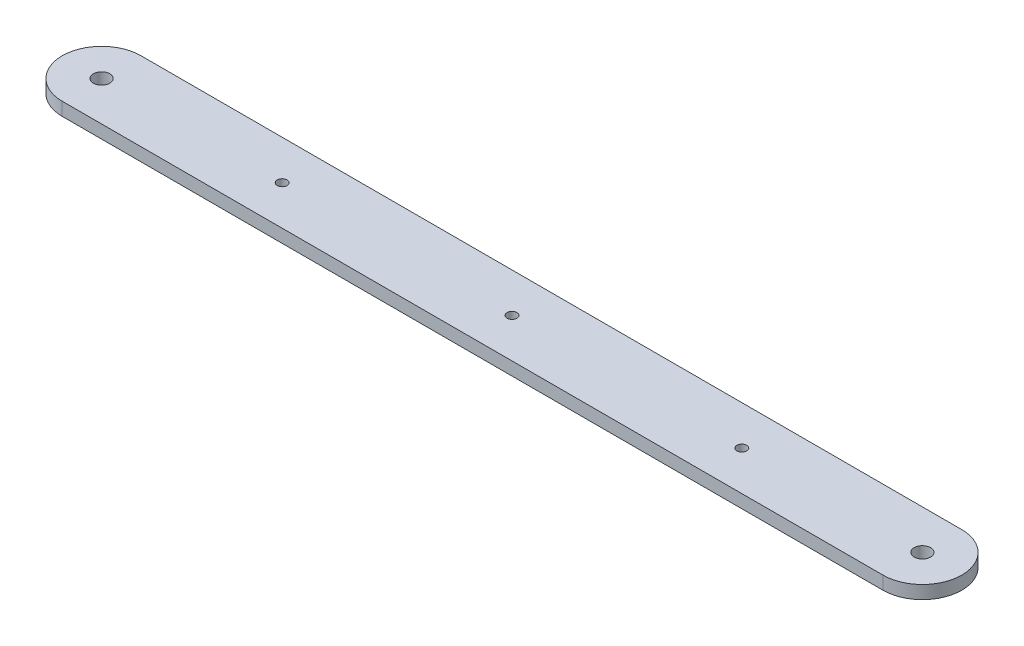
ISO-10303-21;
HEADER;
FILE_DESCRIPTION(('STEP AP214'),'2;1');
FILE_NAME('part.step','',(''),(''),'','','');
FILE_SCHEMA(('AUTOMOTIVE_DESIGN { 1 0 10303 214 1 1 1 1 }'));
ENDSEC;
DATA;
#1=APPLICATION_CONTEXT('core data for automotive mechanical design processes');
#2=APPLICATION_PROTOCOL_DEFINITION('international standard','automotive_design',2000,#1);
#3=PRODUCT_CONTEXT('',#1,'mechanical');
#4=PRODUCT('Part','Part','',(#3));
#5=PRODUCT_RELATED_PRODUCT_CATEGORY('part','',(#4));
#6=PRODUCT_DEFINITION_FORMATION('','',#4);
#7=PRODUCT_DEFINITION_CONTEXT('part definition',#1,'design');
#8=PRODUCT_DEFINITION('design','',#6,#7);
#9=PRODUCT_DEFINITION_SHAPE('','',#8);
#10=(LENGTH_UNIT() NAMED_UNIT(*) SI_UNIT(.MILLI.,.METRE.));
#11=(NAMED_UNIT(*) PLANE_ANGLE_UNIT() SI_UNIT($,.RADIAN.));
#12=(NAMED_UNIT(*) SI_UNIT($,.STERADIAN.) SOLID_ANGLE_UNIT());
#13=UNCERTAINTY_MEASURE_WITH_UNIT(LENGTH_MEASURE(1.E-05),#10,'distance_accuracy_value','');
#14=(GEOMETRIC_REPRESENTATION_CONTEXT(3) GLOBAL_UNCERTAINTY_ASSIGNED_CONTEXT((#13)) GLOBAL_UNIT_ASSIGNED_CONTEXT((#10,
#11,#12)) REPRESENTATION_CONTEXT('',''));
#15=CARTESIAN_POINT('',(0.,0.,0.));
#16=DIRECTION('',(0.,0.,1.));
#17=DIRECTION('',(1.,0.,0.));
#18=AXIS2_PLACEMENT_3D('',#15,#16,#17);
#19=CARTESIAN_POINT('',(-125.,4.,0.));
#20=DIRECTION('',(0.,1.,0.));
#21=DIRECTION('',(0.,0.,1.));
#22=AXIS2_PLACEMENT_3D('',#19,#20,#21);
#23=PLANE('',#22);
#24=CARTESIAN_POINT('',(-70.,4.,0.));
#25=DIRECTION('',(0.,-1.,0.));
#26=DIRECTION('',(0.,0.,-1.));
#27=AXIS2_PLACEMENT_3D('',#24,#25,#26);
#28=CIRCLE('',#27,1.5);
#29=CARTESIAN_POINT('',(-70.,4.,-1.5));
#30=VERTEX_POINT('',#29);
#31=EDGE_CURVE('E150',#30,#30,#28,.T.);
#32=ORIENTED_EDGE('',*,*,#31,.T.);
#33=EDGE_LOOP('',(#32));
#34=FACE_BOUND('',#33,.T.);
#35=CARTESIAN_POINT('',(0.,4.,0.));
#36=DIRECTION('',(0.,-1.,0.));
#37=DIRECTION('',(0.,0.,-1.));
#38=AXIS2_PLACEMENT_3D('',#35,#36,#37);
#39=CIRCLE('',#38,1.5);
#40=CARTESIAN_POINT('',(0.,4.,-1.49999999999999));
#41=VERTEX_POINT('',#40);
#42=EDGE_CURVE('E160',#41,#41,#39,.T.);
#43=ORIENTED_EDGE('',*,*,#42,.T.);
#44=EDGE_LOOP('',(#43));
#45=FACE_BOUND('',#44,.T.);
#46=CARTESIAN_POINT('',(70.,4.,0.));
#47=DIRECTION('',(0.,-1.,0.));
#48=DIRECTION('',(0.,0.,-1.));
#49=AXIS2_PLACEMENT_3D('',#46,#47,#48);
#50=CIRCLE('',#49,1.5);
#51=CARTESIAN_POINT('',(70.,4.,-1.49999999999997));
#52=VERTEX_POINT('',#51);
#53=EDGE_CURVE('E153',#52,#52,#50,.T.);
#54=ORIENTED_EDGE('',*,*,#53,.T.);
#55=EDGE_LOOP('',(#54));
#56=FACE_BOUND('',#55,.T.);
#57=CARTESIAN_POINT('',(125.,4.,0.));
#58=DIRECTION('',(0.,1.,0.));
#59=DIRECTION('',(0.,0.,1.));
#60=AXIS2_PLACEMENT_3D('',#57,#58,#59);
#61=CIRCLE('',#60,2.5);
#62=CARTESIAN_POINT('',(125.,4.,2.5));
#63=VERTEX_POINT('',#62);
#64=EDGE_CURVE('E115',#63,#63,#61,.T.);
#65=ORIENTED_EDGE('',*,*,#64,.F.);
#66=EDGE_LOOP('',(#65));
#67=FACE_BOUND('',#66,.T.);
#68=CARTESIAN_POINT('',(-125.,4.,0.));
#69=DIRECTION('',(0.,1.,0.));
#70=DIRECTION('',(0.,0.,1.));
#71=AXIS2_PLACEMENT_3D('',#68,#69,#70);
#72=CIRCLE('',#71,12.);
#73=CARTESIAN_POINT('',(-125.,4.,-12.));
#74=VERTEX_POINT('',#73);
#75=CARTESIAN_POINT('',(-125.,4.,12.));
#76=VERTEX_POINT('',#75);
#77=EDGE_CURVE('E98',#74,#76,#72,.T.);
#78=ORIENTED_EDGE('',*,*,#77,.T.);
#79=DIRECTION('',(1.,0.,0.));
#80=VECTOR('',#79,1.);
#81=CARTESIAN_POINT('',(-125.,4.,12.));
#82=LINE('',#81,#80);
#83=CARTESIAN_POINT('',(125.,4.,12.));
#84=VERTEX_POINT('',#83);
#85=EDGE_CURVE('E93',#76,#84,#82,.T.);
#86=ORIENTED_EDGE('',*,*,#85,.T.);
#87=CARTESIAN_POINT('',(125.,4.,0.));
#88=DIRECTION('',(0.,1.,0.));
#89=DIRECTION('',(0.,0.,1.));
#90=AXIS2_PLACEMENT_3D('',#87,#88,#89);
#91=CIRCLE('',#90,12.);
#92=CARTESIAN_POINT('',(125.,4.,-12.));
#93=VERTEX_POINT('',#92);
#94=EDGE_CURVE('E96',#84,#93,#91,.T.);
#95=ORIENTED_EDGE('',*,*,#94,.T.);
#96=DIRECTION('',(-1.,0.,0.));
#97=VECTOR('',#96,1.);
#98=CARTESIAN_POINT('',(-125.,4.,-12.));
#99=LINE('',#98,#97);
#100=EDGE_CURVE('E63',#93,#74,#99,.T.);
#101=ORIENTED_EDGE('',*,*,#100,.T.);
#102=EDGE_LOOP('',(#78,#86,#95,#101));
#103=FACE_BOUND('',#102,.T.);
#104=CARTESIAN_POINT('',(-125.,4.,0.));
#105=DIRECTION('',(0.,1.,0.));
#106=DIRECTION('',(0.,0.,1.));
#107=AXIS2_PLACEMENT_3D('',#104,#105,#106);
#108=CIRCLE('',#107,2.5);
#109=CARTESIAN_POINT('',(-125.,4.,2.5));
#110=VERTEX_POINT('',#109);
#111=EDGE_CURVE('E143',#110,#110,#108,.T.);
#112=ORIENTED_EDGE('',*,*,#111,.F.);
#113=EDGE_LOOP('',(#112));
#114=FACE_BOUND('',#113,.T.);
#115=ADVANCED_FACE('F46',(#34,#45,#56,#67,#103,#114),#23,.T.);
#116=CARTESIAN_POINT('',(-125.,0.,0.));
#117=DIRECTION('',(0.,1.,0.));
#118=DIRECTION('',(0.,0.,1.));
#119=AXIS2_PLACEMENT_3D('',#116,#117,#118);
#120=PLANE('',#119);
#121=CARTESIAN_POINT('',(-70.,0.,0.));
#122=DIRECTION('',(0.,-1.,0.));
#123=DIRECTION('',(0.,0.,-1.));
#124=AXIS2_PLACEMENT_3D('',#121,#122,#123);
#125=CIRCLE('',#124,1.5);
#126=CARTESIAN_POINT('',(-70.,0.,-1.5));
#127=VERTEX_POINT('',#126);
#128=EDGE_CURVE('E168',#127,#127,#125,.T.);
#129=ORIENTED_EDGE('',*,*,#128,.F.);
#130=EDGE_LOOP('',(#129));
#131=FACE_BOUND('',#130,.T.);
#132=CARTESIAN_POINT('',(0.,0.,0.));
#133=DIRECTION('',(0.,-1.,0.));
#134=DIRECTION('',(0.,0.,-1.));
#135=AXIS2_PLACEMENT_3D('',#132,#133,#134);
#136=CIRCLE('',#135,1.5);
#137=CARTESIAN_POINT('',(0.,0.,-1.49999999999999));
#138=VERTEX_POINT('',#137);
#139=EDGE_CURVE('E163',#138,#138,#136,.T.);
#140=ORIENTED_EDGE('',*,*,#139,.F.);
#141=EDGE_LOOP('',(#140));
#142=FACE_BOUND('',#141,.T.);
#143=CARTESIAN_POINT('',(70.,0.,0.));
#144=DIRECTION('',(0.,-1.,0.));
#145=DIRECTION('',(0.,0.,-1.));
#146=AXIS2_PLACEMENT_3D('',#143,#144,#145);
#147=CIRCLE('',#146,1.5);
#148=CARTESIAN_POINT('',(70.,0.,-1.49999999999997));
#149=VERTEX_POINT('',#148);
#150=EDGE_CURVE('E155',#149,#149,#147,.T.);
#151=ORIENTED_EDGE('',*,*,#150,.F.);
#152=EDGE_LOOP('',(#151));
#153=FACE_BOUND('',#152,.T.);
#154=CARTESIAN_POINT('',(-125.,0.,0.));
#155=DIRECTION('',(0.,1.,0.));
#156=DIRECTION('',(0.,0.,1.));
#157=AXIS2_PLACEMENT_3D('',#154,#155,#156);
#158=CIRCLE('',#157,12.);
#159=CARTESIAN_POINT('',(-125.,0.,-12.));
#160=VERTEX_POINT('',#159);
#161=CARTESIAN_POINT('',(-125.,0.,12.));
#162=VERTEX_POINT('',#161);
#163=EDGE_CURVE('E110',#160,#162,#158,.T.);
#164=ORIENTED_EDGE('',*,*,#163,.F.);
#165=DIRECTION('',(-1.,0.,0.));
#166=VECTOR('',#165,1.);
#167=CARTESIAN_POINT('',(-125.,0.,-12.));
#168=LINE('',#167,#166);
#169=CARTESIAN_POINT('',(125.,0.,-12.));
#170=VERTEX_POINT('',#169);
#171=EDGE_CURVE('E86',#170,#160,#168,.T.);
#172=ORIENTED_EDGE('',*,*,#171,.F.);
#173=CARTESIAN_POINT('',(125.,0.,0.));
#174=DIRECTION('',(0.,1.,0.));
#175=DIRECTION('',(0.,0.,1.));
#176=AXIS2_PLACEMENT_3D('',#173,#174,#175);
#177=CIRCLE('',#176,12.);
#178=CARTESIAN_POINT('',(125.,0.,12.));
#179=VERTEX_POINT('',#178);
#180=EDGE_CURVE('E80',#179,#170,#177,.T.);
#181=ORIENTED_EDGE('',*,*,#180,.F.);
#182=DIRECTION('',(1.,0.,0.));
#183=VECTOR('',#182,1.);
#184=CARTESIAN_POINT('',(-125.,0.,12.));
#185=LINE('',#184,#183);
#186=EDGE_CURVE('E102',#162,#179,#185,.T.);
#187=ORIENTED_EDGE('',*,*,#186,.F.);
#188=EDGE_LOOP('',(#164,#172,#181,#187));
#189=FACE_BOUND('',#188,.T.);
#190=CARTESIAN_POINT('',(125.,0.,0.));
#191=DIRECTION('',(0.,1.,0.));
#192=DIRECTION('',(0.,0.,1.));
#193=AXIS2_PLACEMENT_3D('',#190,#191,#192);
#194=CIRCLE('',#193,2.5);
#195=CARTESIAN_POINT('',(125.,0.,2.5));
#196=VERTEX_POINT('',#195);
#197=EDGE_CURVE('E138',#196,#196,#194,.T.);
#198=ORIENTED_EDGE('',*,*,#197,.T.);
#199=EDGE_LOOP('',(#198));
#200=FACE_BOUND('',#199,.T.);
#201=CARTESIAN_POINT('',(-125.,0.,0.));
#202=DIRECTION('',(0.,1.,0.));
#203=DIRECTION('',(0.,0.,1.));
#204=AXIS2_PLACEMENT_3D('',#201,#202,#203);
#205=CIRCLE('',#204,2.5);
#206=CARTESIAN_POINT('',(-125.,0.,2.5));
#207=VERTEX_POINT('',#206);
#208=EDGE_CURVE('E145',#207,#207,#205,.T.);
#209=ORIENTED_EDGE('',*,*,#208,.T.);
#210=EDGE_LOOP('',(#209));
#211=FACE_BOUND('',#210,.T.);
#212=ADVANCED_FACE('F134',(#131,#142,#153,#189,#200,#211),#120,.F.);
#213=CARTESIAN_POINT('',(-125.,4.,0.));
#214=DIRECTION('',(0.,-1.,0.));
#215=DIRECTION('',(0.,0.,-1.));
#216=AXIS2_PLACEMENT_3D('',#213,#214,#215);
#217=CYLINDRICAL_SURFACE('',#216,12.);
#218=ORIENTED_EDGE('',*,*,#163,.T.);
#219=DIRECTION('',(0.,-1.,0.));
#220=VECTOR('',#219,1.);
#221=CARTESIAN_POINT('',(-125.,4.,12.));
#222=LINE('',#221,#220);
#223=EDGE_CURVE('E12',#76,#162,#222,.T.);
#224=ORIENTED_EDGE('',*,*,#223,.F.);
#225=ORIENTED_EDGE('',*,*,#77,.F.);
#226=DIRECTION('',(0.,-1.,0.));
#227=VECTOR('',#226,1.);
#228=CARTESIAN_POINT('',(-125.,4.,-12.));
#229=LINE('',#228,#227);
#230=EDGE_CURVE('E106',#74,#160,#229,.T.);
#231=ORIENTED_EDGE('',*,*,#230,.T.);
#232=EDGE_LOOP('',(#218,#224,#225,#231));
#233=FACE_BOUND('',#232,.T.);
#234=ADVANCED_FACE('F48',(#233),#217,.T.);
#235=CARTESIAN_POINT('',(-125.,4.,12.));
#236=DIRECTION('',(0.,0.,-1.));
#237=DIRECTION('',(-1.,0.,0.));
#238=AXIS2_PLACEMENT_3D('',#235,#236,#237);
#239=PLANE('',#238);
#240=ORIENTED_EDGE('',*,*,#186,.T.);
#241=DIRECTION('',(0.,-1.,0.));
#242=VECTOR('',#241,1.);
#243=CARTESIAN_POINT('',(125.,4.,12.));
#244=LINE('',#243,#242);
#245=EDGE_CURVE('E55',#84,#179,#244,.T.);
#246=ORIENTED_EDGE('',*,*,#245,.F.);
#247=ORIENTED_EDGE('',*,*,#85,.F.);
#248=ORIENTED_EDGE('',*,*,#223,.T.);
#249=EDGE_LOOP('',(#240,#246,#247,#248));
#250=FACE_BOUND('',#249,.T.);
#251=ADVANCED_FACE('F101',(#250),#239,.F.);
#252=CARTESIAN_POINT('',(125.,4.,0.));
#253=DIRECTION('',(0.,-1.,0.));
#254=DIRECTION('',(0.,0.,-1.));
#255=AXIS2_PLACEMENT_3D('',#252,#253,#254);
#256=CYLINDRICAL_SURFACE('',#255,12.);
#257=ORIENTED_EDGE('',*,*,#180,.T.);
#258=DIRECTION('',(0.,-1.,0.));
#259=VECTOR('',#258,1.);
#260=CARTESIAN_POINT('',(125.,4.,-12.));
#261=LINE('',#260,#259);
#262=EDGE_CURVE('E103',#93,#170,#261,.T.);
#263=ORIENTED_EDGE('',*,*,#262,.F.);
#264=ORIENTED_EDGE('',*,*,#94,.F.);
#265=ORIENTED_EDGE('',*,*,#245,.T.);
#266=EDGE_LOOP('',(#257,#263,#264,#265));
#267=FACE_BOUND('',#266,.T.);
#268=ADVANCED_FACE('F104',(#267),#256,.T.);
#269=CARTESIAN_POINT('',(-125.,4.,-12.));
#270=DIRECTION('',(0.,0.,1.));
#271=DIRECTION('',(1.,0.,0.));
#272=AXIS2_PLACEMENT_3D('',#269,#270,#271);
#273=PLANE('',#272);
#274=ORIENTED_EDGE('',*,*,#171,.T.);
#275=ORIENTED_EDGE('',*,*,#230,.F.);
#276=ORIENTED_EDGE('',*,*,#100,.F.);
#277=ORIENTED_EDGE('',*,*,#262,.T.);
#278=EDGE_LOOP('',(#274,#275,#276,#277));
#279=FACE_BOUND('',#278,.T.);
#280=ADVANCED_FACE('F131',(#279),#273,.F.);
#281=CARTESIAN_POINT('',(125.,4.,0.));
#282=DIRECTION('',(0.,-1.,0.));
#283=DIRECTION('',(0.,0.,-1.));
#284=AXIS2_PLACEMENT_3D('',#281,#282,#283);
#285=CYLINDRICAL_SURFACE('',#284,2.5);
#286=ORIENTED_EDGE('',*,*,#64,.T.);
#287=EDGE_LOOP('',(#286));
#288=FACE_BOUND('',#287,.T.);
#289=ORIENTED_EDGE('',*,*,#197,.F.);
#290=EDGE_LOOP('',(#289));
#291=FACE_BOUND('',#290,.T.);
#292=ADVANCED_FACE('F204',(#288,#291),#285,.F.);
#293=CARTESIAN_POINT('',(-125.,4.,0.));
#294=DIRECTION('',(0.,-1.,0.));
#295=DIRECTION('',(0.,0.,-1.));
#296=AXIS2_PLACEMENT_3D('',#293,#294,#295);
#297=CYLINDRICAL_SURFACE('',#296,2.5);
#298=ORIENTED_EDGE('',*,*,#111,.T.);
#299=EDGE_LOOP('',(#298));
#300=FACE_BOUND('',#299,.T.);
#301=ORIENTED_EDGE('',*,*,#208,.F.);
#302=EDGE_LOOP('',(#301));
#303=FACE_BOUND('',#302,.T.);
#304=ADVANCED_FACE('F195',(#300,#303),#297,.F.);
#305=CARTESIAN_POINT('',(70.,4.,0.));
#306=DIRECTION('',(0.,-1.,0.));
#307=DIRECTION('',(0.,0.,-1.));
#308=AXIS2_PLACEMENT_3D('',#305,#306,#307);
#309=CYLINDRICAL_SURFACE('',#308,1.5);
#310=ORIENTED_EDGE('',*,*,#53,.F.);
#311=EDGE_LOOP('',(#310));
#312=FACE_BOUND('',#311,.T.);
#313=ORIENTED_EDGE('',*,*,#150,.T.);
#314=EDGE_LOOP('',(#313));
#315=FACE_BOUND('',#314,.T.);
#316=ADVANCED_FACE('F193',(#312,#315),#309,.F.);
#317=CARTESIAN_POINT('',(0.,4.,0.));
#318=DIRECTION('',(0.,-1.,0.));
#319=DIRECTION('',(0.,0.,-1.));
#320=AXIS2_PLACEMENT_3D('',#317,#318,#319);
#321=CYLINDRICAL_SURFACE('',#320,1.5);
#322=ORIENTED_EDGE('',*,*,#42,.F.);
#323=EDGE_LOOP('',(#322));
#324=FACE_BOUND('',#323,.T.);
#325=ORIENTED_EDGE('',*,*,#139,.T.);
#326=EDGE_LOOP('',(#325));
#327=FACE_BOUND('',#326,.T.);
#328=ADVANCED_FACE('F182',(#324,#327),#321,.F.);
#329=CARTESIAN_POINT('',(-70.,4.,0.));
#330=DIRECTION('',(0.,-1.,0.));
#331=DIRECTION('',(0.,0.,-1.));
#332=AXIS2_PLACEMENT_3D('',#329,#330,#331);
#333=CYLINDRICAL_SURFACE('',#332,1.5);
#334=ORIENTED_EDGE('',*,*,#31,.F.);
#335=EDGE_LOOP('',(#334));
#336=FACE_BOUND('',#335,.T.);
#337=ORIENTED_EDGE('',*,*,#128,.T.);
#338=EDGE_LOOP('',(#337));
#339=FACE_BOUND('',#338,.T.);
#340=ADVANCED_FACE('F179',(#336,#339),#333,.F.);
#341=CLOSED_SHELL('',(#115,#212,#234,#251,#268,#280,#292,#304,#316,#328,#340));
#342=MANIFOLD_SOLID_BREP('B2',#341);
#343=ADVANCED_BREP_SHAPE_REPRESENTATION('',(#18,#342),#14);
#344=SHAPE_DEFINITION_REPRESENTATION(#9,#343);
ENDSEC;
END-ISO-10303-21;
